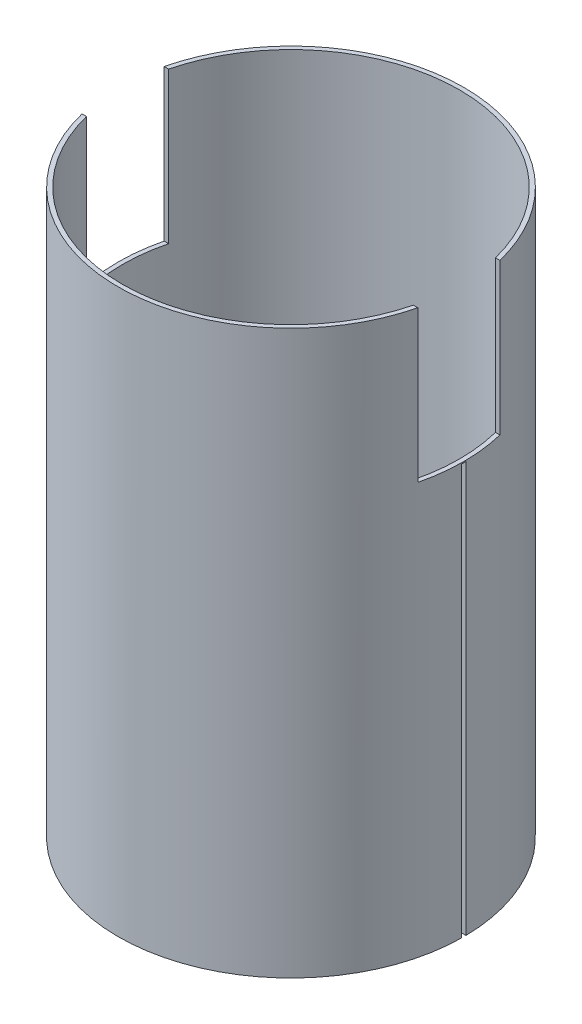
ISO-10303-21;
HEADER;
FILE_DESCRIPTION(('STEP AP214'),'2;1');
FILE_NAME('part.step','',(''),(''),'','','');
FILE_SCHEMA(('AUTOMOTIVE_DESIGN { 1 0 10303 214 1 1 1 1 }'));
ENDSEC;
DATA;
#1=APPLICATION_CONTEXT('core data for automotive mechanical design processes');
#2=APPLICATION_PROTOCOL_DEFINITION('international standard','automotive_design',2000,#1);
#3=PRODUCT_CONTEXT('',#1,'mechanical');
#4=PRODUCT('Part','Part','',(#3));
#5=PRODUCT_RELATED_PRODUCT_CATEGORY('part','',(#4));
#6=PRODUCT_DEFINITION_FORMATION('','',#4);
#7=PRODUCT_DEFINITION_CONTEXT('part definition',#1,'design');
#8=PRODUCT_DEFINITION('design','',#6,#7);
#9=PRODUCT_DEFINITION_SHAPE('','',#8);
#10=(LENGTH_UNIT() NAMED_UNIT(*) SI_UNIT(.MILLI.,.METRE.));
#11=(NAMED_UNIT(*) PLANE_ANGLE_UNIT() SI_UNIT($,.RADIAN.));
#12=(NAMED_UNIT(*) SI_UNIT($,.STERADIAN.) SOLID_ANGLE_UNIT());
#13=UNCERTAINTY_MEASURE_WITH_UNIT(LENGTH_MEASURE(1.E-05),#10,'distance_accuracy_value','');
#14=(GEOMETRIC_REPRESENTATION_CONTEXT(3) GLOBAL_UNCERTAINTY_ASSIGNED_CONTEXT((#13)) GLOBAL_UNIT_ASSIGNED_CONTEXT((#10,
#11,#12)) REPRESENTATION_CONTEXT('',''));
#15=CARTESIAN_POINT('',(0.,0.,0.));
#16=DIRECTION('',(0.,0.,1.));
#17=DIRECTION('',(1.,0.,0.));
#18=AXIS2_PLACEMENT_3D('',#15,#16,#17);
#19=CARTESIAN_POINT('',(-41.5,130.25,9.5));
#20=DIRECTION('',(0.,0.,1.));
#21=DIRECTION('',(1.,0.,0.));
#22=AXIS2_PLACEMENT_3D('',#19,#20,#21);
#23=PLANE('',#22);
#24=DIRECTION('',(1.,0.,0.));
#25=VECTOR('',#24,1.);
#26=CARTESIAN_POINT('',(-41.5,95.25,9.5));
#27=LINE('',#26,#25);
#28=CARTESIAN_POINT('',(37.8252561128142,95.25,9.50000000000052));
#29=VERTEX_POINT('',#28);
#30=CARTESIAN_POINT('',(38.855501540966,95.25,9.49999999999952));
#31=VERTEX_POINT('',#30);
#32=EDGE_CURVE('E214',#29,#31,#27,.T.);
#33=ORIENTED_EDGE('',*,*,#32,.F.);
#34=DIRECTION('',(0.,1.,0.));
#35=VECTOR('',#34,1.);
#36=CARTESIAN_POINT('',(37.8252561128141,0.,9.50000000000103));
#37=LINE('',#36,#35);
#38=CARTESIAN_POINT('',(37.8252561128142,130.25,9.50000000000052));
#39=VERTEX_POINT('',#38);
#40=EDGE_CURVE('E21',#29,#39,#37,.T.);
#41=ORIENTED_EDGE('',*,*,#40,.T.);
#42=DIRECTION('',(-1.,0.,0.));
#43=VECTOR('',#42,1.);
#44=CARTESIAN_POINT('',(0.,130.25,9.5));
#45=LINE('',#44,#43);
#46=CARTESIAN_POINT('',(38.855501540966,130.25,9.49999999999952));
#47=VERTEX_POINT('',#46);
#48=EDGE_CURVE('E11',#47,#39,#45,.T.);
#49=ORIENTED_EDGE('',*,*,#48,.F.);
#50=DIRECTION('',(0.,1.,0.));
#51=VECTOR('',#50,1.);
#52=CARTESIAN_POINT('',(38.8555015409661,0.,9.49999999999904));
#53=LINE('',#52,#51);
#54=EDGE_CURVE('E222',#31,#47,#53,.T.);
#55=ORIENTED_EDGE('',*,*,#54,.F.);
#56=EDGE_LOOP('',(#33,#41,#49,#55));
#57=FACE_BOUND('',#56,.T.);
#58=ADVANCED_FACE('F17',(#57),#23,.F.);
#59=CARTESIAN_POINT('',(0.,130.25,0.));
#60=DIRECTION('',(0.,1.,0.));
#61=DIRECTION('',(1.,0.,0.));
#62=AXIS2_PLACEMENT_3D('',#59,#60,#61);
#63=PLANE('',#62);
#64=CARTESIAN_POINT('',(0.,130.25,0.));
#65=DIRECTION('',(0.,-1.,0.));
#66=DIRECTION('',(0.,0.,1.));
#67=AXIS2_PLACEMENT_3D('',#64,#65,#66);
#68=CIRCLE('',#67,39.);
#69=CARTESIAN_POINT('',(-37.8252561128142,130.25,9.50000000000051));
#70=VERTEX_POINT('',#69);
#71=EDGE_CURVE('E233',#39,#70,#68,.T.);
#72=ORIENTED_EDGE('',*,*,#71,.T.);
#73=DIRECTION('',(-1.,0.,0.));
#74=VECTOR('',#73,1.);
#75=CARTESIAN_POINT('',(-41.5,130.25,9.5));
#76=LINE('',#75,#74);
#77=CARTESIAN_POINT('',(-38.855501540966,130.25,9.49999999999952));
#78=VERTEX_POINT('',#77);
#79=EDGE_CURVE('E28',#70,#78,#76,.T.);
#80=ORIENTED_EDGE('',*,*,#79,.T.);
#81=CARTESIAN_POINT('',(0.,130.25,0.));
#82=DIRECTION('',(0.,-1.,0.));
#83=DIRECTION('',(0.,0.,1.));
#84=AXIS2_PLACEMENT_3D('',#81,#82,#83);
#85=CIRCLE('',#84,40.);
#86=EDGE_CURVE('E190',#47,#78,#85,.T.);
#87=ORIENTED_EDGE('',*,*,#86,.F.);
#88=ORIENTED_EDGE('',*,*,#48,.T.);
#89=EDGE_LOOP('',(#72,#80,#87,#88));
#90=FACE_BOUND('',#89,.T.);
#91=ADVANCED_FACE('F287',(#90),#63,.T.);
#92=CARTESIAN_POINT('',(-41.5,130.25,9.5));
#93=DIRECTION('',(0.,0.,1.));
#94=DIRECTION('',(1.,0.,0.));
#95=AXIS2_PLACEMENT_3D('',#92,#93,#94);
#96=PLANE('',#95);
#97=DIRECTION('',(1.,0.,0.));
#98=VECTOR('',#97,1.);
#99=CARTESIAN_POINT('',(-41.5,95.25,9.5));
#100=LINE('',#99,#98);
#101=CARTESIAN_POINT('',(-38.855501540966,95.25,9.49999999999952));
#102=VERTEX_POINT('',#101);
#103=CARTESIAN_POINT('',(-37.8252561128142,95.25,9.50000000000051));
#104=VERTEX_POINT('',#103);
#105=EDGE_CURVE('E250',#102,#104,#100,.T.);
#106=ORIENTED_EDGE('',*,*,#105,.F.);
#107=DIRECTION('',(0.,-1.,0.));
#108=VECTOR('',#107,1.);
#109=CARTESIAN_POINT('',(-38.8555015409661,0.,9.49999999999903));
#110=LINE('',#109,#108);
#111=EDGE_CURVE('E185',#78,#102,#110,.T.);
#112=ORIENTED_EDGE('',*,*,#111,.F.);
#113=ORIENTED_EDGE('',*,*,#79,.F.);
#114=DIRECTION('',(0.,-1.,0.));
#115=VECTOR('',#114,1.);
#116=CARTESIAN_POINT('',(-37.8252561128141,0.,9.50000000000102));
#117=LINE('',#116,#115);
#118=EDGE_CURVE('E225',#70,#104,#117,.T.);
#119=ORIENTED_EDGE('',*,*,#118,.T.);
#120=EDGE_LOOP('',(#106,#112,#113,#119));
#121=FACE_BOUND('',#120,.T.);
#122=ADVANCED_FACE('F349',(#121),#96,.F.);
#123=CARTESIAN_POINT('',(0.,95.,0.5));
#124=DIRECTION('',(0.,0.,1.));
#125=DIRECTION('',(1.,0.,0.));
#126=AXIS2_PLACEMENT_3D('',#123,#124,#125);
#127=PLANE('',#126);
#128=DIRECTION('',(-1.,0.,0.));
#129=VECTOR('',#128,1.);
#130=CARTESIAN_POINT('',(0.,95.,0.5));
#131=LINE('',#130,#129);
#132=CARTESIAN_POINT('',(39.9968748779201,95.,0.5));
#133=VERTEX_POINT('',#132);
#134=CARTESIAN_POINT('',(38.9967947400809,95.,0.500000000000006));
#135=VERTEX_POINT('',#134);
#136=EDGE_CURVE('E42',#133,#135,#131,.T.);
#137=ORIENTED_EDGE('',*,*,#136,.F.);
#138=DIRECTION('',(0.,1.,0.));
#139=VECTOR('',#138,1.);
#140=CARTESIAN_POINT('',(39.9968748779201,0.,0.5));
#141=LINE('',#140,#139);
#142=CARTESIAN_POINT('',(39.9968748779201,0.,0.5));
#143=VERTEX_POINT('',#142);
#144=EDGE_CURVE('E179',#143,#133,#141,.T.);
#145=ORIENTED_EDGE('',*,*,#144,.F.);
#146=DIRECTION('',(-1.,0.,0.));
#147=VECTOR('',#146,1.);
#148=CARTESIAN_POINT('',(0.,0.,0.5));
#149=LINE('',#148,#147);
#150=CARTESIAN_POINT('',(38.9967947400809,0.,0.500000000000006));
#151=VERTEX_POINT('',#150);
#152=EDGE_CURVE('E253',#143,#151,#149,.T.);
#153=ORIENTED_EDGE('',*,*,#152,.T.);
#154=DIRECTION('',(0.,1.,0.));
#155=VECTOR('',#154,1.);
#156=CARTESIAN_POINT('',(38.9967947400809,0.,0.500000000000012));
#157=LINE('',#156,#155);
#158=EDGE_CURVE('E247',#151,#135,#157,.T.);
#159=ORIENTED_EDGE('',*,*,#158,.T.);
#160=EDGE_LOOP('',(#137,#145,#153,#159));
#161=FACE_BOUND('',#160,.T.);
#162=ADVANCED_FACE('F354',(#161),#127,.F.);
#163=CARTESIAN_POINT('',(0.,0.,0.));
#164=DIRECTION('',(0.,1.,0.));
#165=DIRECTION('',(1.,0.,0.));
#166=AXIS2_PLACEMENT_3D('',#163,#164,#165);
#167=PLANE('',#166);
#168=CARTESIAN_POINT('',(0.,0.,0.));
#169=DIRECTION('',(0.,-1.,0.));
#170=DIRECTION('',(0.,0.,1.));
#171=AXIS2_PLACEMENT_3D('',#168,#169,#170);
#172=CIRCLE('',#171,39.);
#173=CARTESIAN_POINT('',(0.,0.,-39.));
#174=VERTEX_POINT('',#173);
#175=EDGE_CURVE('E265',#151,#174,#172,.T.);
#176=ORIENTED_EDGE('',*,*,#175,.F.);
#177=ORIENTED_EDGE('',*,*,#152,.F.);
#178=CARTESIAN_POINT('',(0.,0.,0.));
#179=DIRECTION('',(0.,1.,0.));
#180=DIRECTION('',(0.,0.,1.));
#181=AXIS2_PLACEMENT_3D('',#178,#179,#180);
#182=CIRCLE('',#181,40.);
#183=CARTESIAN_POINT('',(0.,0.,-40.));
#184=VERTEX_POINT('',#183);
#185=EDGE_CURVE('E162',#184,#143,#182,.T.);
#186=ORIENTED_EDGE('',*,*,#185,.F.);
#187=CARTESIAN_POINT('',(0.,0.,0.));
#188=DIRECTION('',(0.,1.,0.));
#189=DIRECTION('',(0.,0.,1.));
#190=AXIS2_PLACEMENT_3D('',#187,#188,#189);
#191=CIRCLE('',#190,40.);
#192=CARTESIAN_POINT('',(39.9968748779201,0.,-0.5));
#193=VERTEX_POINT('',#192);
#194=EDGE_CURVE('E157',#193,#184,#191,.T.);
#195=ORIENTED_EDGE('',*,*,#194,.F.);
#196=DIRECTION('',(-1.,0.,0.));
#197=VECTOR('',#196,1.);
#198=CARTESIAN_POINT('',(0.,0.,-0.5));
#199=LINE('',#198,#197);
#200=CARTESIAN_POINT('',(38.9967947400804,0.,-0.5));
#201=VERTEX_POINT('',#200);
#202=EDGE_CURVE('E143',#193,#201,#199,.T.);
#203=ORIENTED_EDGE('',*,*,#202,.T.);
#204=CARTESIAN_POINT('',(0.,0.,0.));
#205=DIRECTION('',(0.,-1.,0.));
#206=DIRECTION('',(0.,0.,1.));
#207=AXIS2_PLACEMENT_3D('',#204,#205,#206);
#208=CIRCLE('',#207,39.);
#209=EDGE_CURVE('E210',#174,#201,#208,.T.);
#210=ORIENTED_EDGE('',*,*,#209,.F.);
#211=EDGE_LOOP('',(#176,#177,#186,#195,#203,#210));
#212=FACE_BOUND('',#211,.T.);
#213=ADVANCED_FACE('F159',(#212),#167,.F.);
#214=CARTESIAN_POINT('',(-41.5,95.25,9.5));
#215=DIRECTION('',(0.,-1.,0.));
#216=DIRECTION('',(0.,0.,-1.));
#217=AXIS2_PLACEMENT_3D('',#214,#215,#216);
#218=PLANE('',#217);
#219=DIRECTION('',(-1.,0.,0.));
#220=VECTOR('',#219,1.);
#221=CARTESIAN_POINT('',(-41.5,95.25,-9.5));
#222=LINE('',#221,#220);
#223=CARTESIAN_POINT('',(-37.8252561128122,95.25,-9.5));
#224=VERTEX_POINT('',#223);
#225=CARTESIAN_POINT('',(-38.855501540966,95.25,-9.49999999999952));
#226=VERTEX_POINT('',#225);
#227=EDGE_CURVE('E254',#224,#226,#222,.T.);
#228=ORIENTED_EDGE('',*,*,#227,.T.);
#229=CARTESIAN_POINT('',(0.,95.25,0.));
#230=DIRECTION('',(0.,-1.,0.));
#231=DIRECTION('',(0.,0.,1.));
#232=AXIS2_PLACEMENT_3D('',#229,#230,#231);
#233=CIRCLE('',#232,40.);
#234=EDGE_CURVE('E189',#102,#226,#233,.T.);
#235=ORIENTED_EDGE('',*,*,#234,.F.);
#236=ORIENTED_EDGE('',*,*,#105,.T.);
#237=CARTESIAN_POINT('',(0.,95.25,0.));
#238=DIRECTION('',(0.,1.,0.));
#239=DIRECTION('',(0.,0.,1.));
#240=AXIS2_PLACEMENT_3D('',#237,#238,#239);
#241=CIRCLE('',#240,39.);
#242=EDGE_CURVE('E200',#224,#104,#241,.T.);
#243=ORIENTED_EDGE('',*,*,#242,.F.);
#244=EDGE_LOOP('',(#228,#235,#236,#243));
#245=FACE_BOUND('',#244,.T.);
#246=ADVANCED_FACE('F361',(#245),#218,.F.);
#247=CARTESIAN_POINT('',(-41.5,95.25,-9.5));
#248=DIRECTION('',(0.,0.,-1.));
#249=DIRECTION('',(0.,-1.,0.));
#250=AXIS2_PLACEMENT_3D('',#247,#248,#249);
#251=PLANE('',#250);
#252=ORIENTED_EDGE('',*,*,#227,.F.);
#253=DIRECTION('',(0.,-1.,0.));
#254=VECTOR('',#253,1.);
#255=CARTESIAN_POINT('',(-37.82525611281,95.25,-9.5));
#256=LINE('',#255,#254);
#257=CARTESIAN_POINT('',(-37.8252561128122,130.25,-9.5));
#258=VERTEX_POINT('',#257);
#259=EDGE_CURVE('E196',#258,#224,#256,.T.);
#260=ORIENTED_EDGE('',*,*,#259,.F.);
#261=DIRECTION('',(1.,0.,0.));
#262=VECTOR('',#261,1.);
#263=CARTESIAN_POINT('',(0.,130.25,-9.5));
#264=LINE('',#263,#262);
#265=CARTESIAN_POINT('',(-38.855501540966,130.25,-9.49999999999952));
#266=VERTEX_POINT('',#265);
#267=EDGE_CURVE('E217',#266,#258,#264,.T.);
#268=ORIENTED_EDGE('',*,*,#267,.F.);
#269=DIRECTION('',(0.,1.,0.));
#270=VECTOR('',#269,1.);
#271=CARTESIAN_POINT('',(-38.8555015409661,0.,-9.49999999999905));
#272=LINE('',#271,#270);
#273=EDGE_CURVE('E191',#226,#266,#272,.T.);
#274=ORIENTED_EDGE('',*,*,#273,.F.);
#275=EDGE_LOOP('',(#252,#260,#268,#274));
#276=FACE_BOUND('',#275,.T.);
#277=ADVANCED_FACE('F352',(#276),#251,.F.);
#278=CARTESIAN_POINT('',(0.,130.25,0.));
#279=DIRECTION('',(0.,1.,0.));
#280=DIRECTION('',(1.,0.,0.));
#281=AXIS2_PLACEMENT_3D('',#278,#279,#280);
#282=PLANE('',#281);
#283=CARTESIAN_POINT('',(0.,130.25,0.));
#284=DIRECTION('',(0.,-1.,0.));
#285=DIRECTION('',(0.,0.,1.));
#286=AXIS2_PLACEMENT_3D('',#283,#284,#285);
#287=CIRCLE('',#286,40.);
#288=CARTESIAN_POINT('',(0.,130.25,-40.));
#289=VERTEX_POINT('',#288);
#290=EDGE_CURVE('E195',#266,#289,#287,.T.);
#291=ORIENTED_EDGE('',*,*,#290,.F.);
#292=ORIENTED_EDGE('',*,*,#267,.T.);
#293=CARTESIAN_POINT('',(0.,130.25,0.));
#294=DIRECTION('',(0.,-1.,0.));
#295=DIRECTION('',(0.,0.,1.));
#296=AXIS2_PLACEMENT_3D('',#293,#294,#295);
#297=CIRCLE('',#296,39.);
#298=CARTESIAN_POINT('',(0.,130.25,-39.));
#299=VERTEX_POINT('',#298);
#300=EDGE_CURVE('E183',#258,#299,#297,.T.);
#301=ORIENTED_EDGE('',*,*,#300,.T.);
#302=CARTESIAN_POINT('',(0.,130.25,0.));
#303=DIRECTION('',(0.,-1.,0.));
#304=DIRECTION('',(0.,0.,1.));
#305=AXIS2_PLACEMENT_3D('',#302,#303,#304);
#306=CIRCLE('',#305,39.);
#307=CARTESIAN_POINT('',(37.8252561128122,130.25,-9.5));
#308=VERTEX_POINT('',#307);
#309=EDGE_CURVE('E206',#299,#308,#306,.T.);
#310=ORIENTED_EDGE('',*,*,#309,.T.);
#311=DIRECTION('',(1.,0.,0.));
#312=VECTOR('',#311,1.);
#313=CARTESIAN_POINT('',(-41.5,130.25,-9.5));
#314=LINE('',#313,#312);
#315=CARTESIAN_POINT('',(38.855501540966,130.25,-9.49999999999952));
#316=VERTEX_POINT('',#315);
#317=EDGE_CURVE('E215',#308,#316,#314,.T.);
#318=ORIENTED_EDGE('',*,*,#317,.T.);
#319=CARTESIAN_POINT('',(0.,130.25,0.));
#320=DIRECTION('',(0.,-1.,0.));
#321=DIRECTION('',(0.,0.,1.));
#322=AXIS2_PLACEMENT_3D('',#319,#320,#321);
#323=CIRCLE('',#322,40.);
#324=EDGE_CURVE('E167',#289,#316,#323,.T.);
#325=ORIENTED_EDGE('',*,*,#324,.F.);
#326=EDGE_LOOP('',(#291,#292,#301,#310,#318,#325));
#327=FACE_BOUND('',#326,.T.);
#328=ADVANCED_FACE('F321',(#327),#282,.T.);
#329=CARTESIAN_POINT('',(-41.5,95.25,-9.5));
#330=DIRECTION('',(0.,0.,-1.));
#331=DIRECTION('',(0.,-1.,0.));
#332=AXIS2_PLACEMENT_3D('',#329,#330,#331);
#333=PLANE('',#332);
#334=DIRECTION('',(1.,0.,0.));
#335=VECTOR('',#334,1.);
#336=CARTESIAN_POINT('',(-41.5,95.25,-9.5));
#337=LINE('',#336,#335);
#338=CARTESIAN_POINT('',(37.8252561128122,95.25,-9.5));
#339=VERTEX_POINT('',#338);
#340=CARTESIAN_POINT('',(38.855501540966,95.25,-9.49999999999952));
#341=VERTEX_POINT('',#340);
#342=EDGE_CURVE('E218',#339,#341,#337,.T.);
#343=ORIENTED_EDGE('',*,*,#342,.T.);
#344=DIRECTION('',(0.,-1.,0.));
#345=VECTOR('',#344,1.);
#346=CARTESIAN_POINT('',(38.8555015409661,0.,-9.49999999999905));
#347=LINE('',#346,#345);
#348=EDGE_CURVE('E201',#316,#341,#347,.T.);
#349=ORIENTED_EDGE('',*,*,#348,.F.);
#350=ORIENTED_EDGE('',*,*,#317,.F.);
#351=DIRECTION('',(0.,1.,0.));
#352=VECTOR('',#351,1.);
#353=CARTESIAN_POINT('',(37.82525611281,95.25,-9.5));
#354=LINE('',#353,#352);
#355=EDGE_CURVE('E211',#339,#308,#354,.T.);
#356=ORIENTED_EDGE('',*,*,#355,.F.);
#357=EDGE_LOOP('',(#343,#349,#350,#356));
#358=FACE_BOUND('',#357,.T.);
#359=ADVANCED_FACE('F326',(#358),#333,.F.);
#360=CARTESIAN_POINT('',(-41.5,95.25,9.5));
#361=DIRECTION('',(0.,-1.,0.));
#362=DIRECTION('',(0.,0.,-1.));
#363=AXIS2_PLACEMENT_3D('',#360,#361,#362);
#364=PLANE('',#363);
#365=ORIENTED_EDGE('',*,*,#32,.T.);
#366=CARTESIAN_POINT('',(0.,95.25,0.));
#367=DIRECTION('',(0.,-1.,0.));
#368=DIRECTION('',(0.,0.,1.));
#369=AXIS2_PLACEMENT_3D('',#366,#367,#368);
#370=CIRCLE('',#369,40.);
#371=EDGE_CURVE('E205',#341,#31,#370,.T.);
#372=ORIENTED_EDGE('',*,*,#371,.F.);
#373=ORIENTED_EDGE('',*,*,#342,.F.);
#374=CARTESIAN_POINT('',(0.,95.25,0.));
#375=DIRECTION('',(0.,1.,0.));
#376=DIRECTION('',(0.,0.,1.));
#377=AXIS2_PLACEMENT_3D('',#374,#375,#376);
#378=CIRCLE('',#377,39.);
#379=EDGE_CURVE('E300',#29,#339,#378,.T.);
#380=ORIENTED_EDGE('',*,*,#379,.F.);
#381=EDGE_LOOP('',(#365,#372,#373,#380));
#382=FACE_BOUND('',#381,.T.);
#383=ADVANCED_FACE('F330',(#382),#364,.F.);
#384=CARTESIAN_POINT('',(0.,95.,-0.5));
#385=DIRECTION('',(0.,1.,0.));
#386=DIRECTION('',(1.,0.,0.));
#387=AXIS2_PLACEMENT_3D('',#384,#385,#386);
#388=PLANE('',#387);
#389=DIRECTION('',(1.,0.,0.));
#390=VECTOR('',#389,1.);
#391=CARTESIAN_POINT('',(0.,95.,-0.5));
#392=LINE('',#391,#390);
#393=CARTESIAN_POINT('',(38.9967947400804,95.,-0.5));
#394=VERTEX_POINT('',#393);
#395=CARTESIAN_POINT('',(39.9968748779201,95.,-0.5));
#396=VERTEX_POINT('',#395);
#397=EDGE_CURVE('E154',#394,#396,#392,.T.);
#398=ORIENTED_EDGE('',*,*,#397,.T.);
#399=CARTESIAN_POINT('',(0.,95.,0.));
#400=DIRECTION('',(0.,1.,0.));
#401=DIRECTION('',(0.,0.,1.));
#402=AXIS2_PLACEMENT_3D('',#399,#400,#401);
#403=CIRCLE('',#402,40.);
#404=EDGE_CURVE('E172',#133,#396,#403,.T.);
#405=ORIENTED_EDGE('',*,*,#404,.F.);
#406=ORIENTED_EDGE('',*,*,#136,.T.);
#407=CARTESIAN_POINT('',(0.,95.,0.));
#408=DIRECTION('',(0.,-1.,0.));
#409=DIRECTION('',(0.,0.,1.));
#410=AXIS2_PLACEMENT_3D('',#407,#408,#409);
#411=CIRCLE('',#410,39.);
#412=EDGE_CURVE('E242',#394,#135,#411,.T.);
#413=ORIENTED_EDGE('',*,*,#412,.F.);
#414=EDGE_LOOP('',(#398,#405,#406,#413));
#415=FACE_BOUND('',#414,.T.);
#416=ADVANCED_FACE('F342',(#415),#388,.F.);
#417=CARTESIAN_POINT('',(0.,0.,-0.5));
#418=DIRECTION('',(0.,0.,-1.));
#419=DIRECTION('',(0.,-1.,0.));
#420=AXIS2_PLACEMENT_3D('',#417,#418,#419);
#421=PLANE('',#420);
#422=ORIENTED_EDGE('',*,*,#397,.F.);
#423=DIRECTION('',(0.,1.,0.));
#424=VECTOR('',#423,1.);
#425=CARTESIAN_POINT('',(38.99679474008,0.,-0.5));
#426=LINE('',#425,#424);
#427=EDGE_CURVE('E150',#201,#394,#426,.T.);
#428=ORIENTED_EDGE('',*,*,#427,.F.);
#429=ORIENTED_EDGE('',*,*,#202,.F.);
#430=DIRECTION('',(0.,-1.,0.));
#431=VECTOR('',#430,1.);
#432=CARTESIAN_POINT('',(39.9968748779201,0.,-0.5));
#433=LINE('',#432,#431);
#434=EDGE_CURVE('E147',#396,#193,#433,.T.);
#435=ORIENTED_EDGE('',*,*,#434,.F.);
#436=EDGE_LOOP('',(#422,#428,#429,#435));
#437=FACE_BOUND('',#436,.T.);
#438=ADVANCED_FACE('F145',(#437),#421,.F.);
#439=CARTESIAN_POINT('',(0.,0.,0.));
#440=DIRECTION('',(0.,1.,0.));
#441=DIRECTION('',(0.,0.,1.));
#442=AXIS2_PLACEMENT_3D('',#439,#440,#441);
#443=CYLINDRICAL_SURFACE('',#442,39.);
#444=ORIENTED_EDGE('',*,*,#175,.T.);
#445=DIRECTION('',(0.,1.,0.));
#446=VECTOR('',#445,1.);
#447=CARTESIAN_POINT('',(0.,0.,-39.));
#448=LINE('',#447,#446);
#449=EDGE_CURVE('E261',#174,#299,#448,.T.);
#450=ORIENTED_EDGE('',*,*,#449,.T.);
#451=ORIENTED_EDGE('',*,*,#300,.F.);
#452=ORIENTED_EDGE('',*,*,#259,.T.);
#453=ORIENTED_EDGE('',*,*,#242,.T.);
#454=ORIENTED_EDGE('',*,*,#118,.F.);
#455=ORIENTED_EDGE('',*,*,#71,.F.);
#456=ORIENTED_EDGE('',*,*,#40,.F.);
#457=ORIENTED_EDGE('',*,*,#379,.T.);
#458=ORIENTED_EDGE('',*,*,#355,.T.);
#459=ORIENTED_EDGE('',*,*,#309,.F.);
#460=ORIENTED_EDGE('',*,*,#449,.F.);
#461=ORIENTED_EDGE('',*,*,#209,.T.);
#462=ORIENTED_EDGE('',*,*,#427,.T.);
#463=ORIENTED_EDGE('',*,*,#412,.T.);
#464=ORIENTED_EDGE('',*,*,#158,.F.);
#465=EDGE_LOOP('',(#444,#450,#451,#452,#453,#454,#455,#456,#457,#458,#459,#460,#461,#462,#463,#464));
#466=FACE_BOUND('',#465,.T.);
#467=ADVANCED_FACE('F19',(#466),#443,.F.);
#468=CARTESIAN_POINT('',(0.,0.,0.));
#469=DIRECTION('',(0.,1.,0.));
#470=DIRECTION('',(0.,0.,1.));
#471=AXIS2_PLACEMENT_3D('',#468,#469,#470);
#472=CYLINDRICAL_SURFACE('',#471,40.);
#473=ORIENTED_EDGE('',*,*,#86,.T.);
#474=ORIENTED_EDGE('',*,*,#111,.T.);
#475=ORIENTED_EDGE('',*,*,#234,.T.);
#476=ORIENTED_EDGE('',*,*,#273,.T.);
#477=ORIENTED_EDGE('',*,*,#290,.T.);
#478=DIRECTION('',(0.,-1.,0.));
#479=VECTOR('',#478,1.);
#480=CARTESIAN_POINT('',(0.,0.,-40.));
#481=LINE('',#480,#479);
#482=EDGE_CURVE('E255',#289,#184,#481,.T.);
#483=ORIENTED_EDGE('',*,*,#482,.T.);
#484=ORIENTED_EDGE('',*,*,#185,.T.);
#485=ORIENTED_EDGE('',*,*,#144,.T.);
#486=ORIENTED_EDGE('',*,*,#404,.T.);
#487=ORIENTED_EDGE('',*,*,#434,.T.);
#488=ORIENTED_EDGE('',*,*,#194,.T.);
#489=ORIENTED_EDGE('',*,*,#482,.F.);
#490=ORIENTED_EDGE('',*,*,#324,.T.);
#491=ORIENTED_EDGE('',*,*,#348,.T.);
#492=ORIENTED_EDGE('',*,*,#371,.T.);
#493=ORIENTED_EDGE('',*,*,#54,.T.);
#494=EDGE_LOOP('',(#473,#474,#475,#476,#477,#483,#484,#485,#486,#487,#488,#489,#490,#491,#492,#493));
#495=FACE_BOUND('',#494,.T.);
#496=ADVANCED_FACE('F170',(#495),#472,.T.);
#497=CLOSED_SHELL('',(#58,#91,#122,#162,#213,#246,#277,#328,#359,#383,#416,#438,#467,#496));
#498=MANIFOLD_SOLID_BREP('B1',#497);
#499=ADVANCED_BREP_SHAPE_REPRESENTATION('',(#18,#498),#14);
#500=SHAPE_DEFINITION_REPRESENTATION(#9,#499);
ENDSEC;
END-ISO-10303-21;
